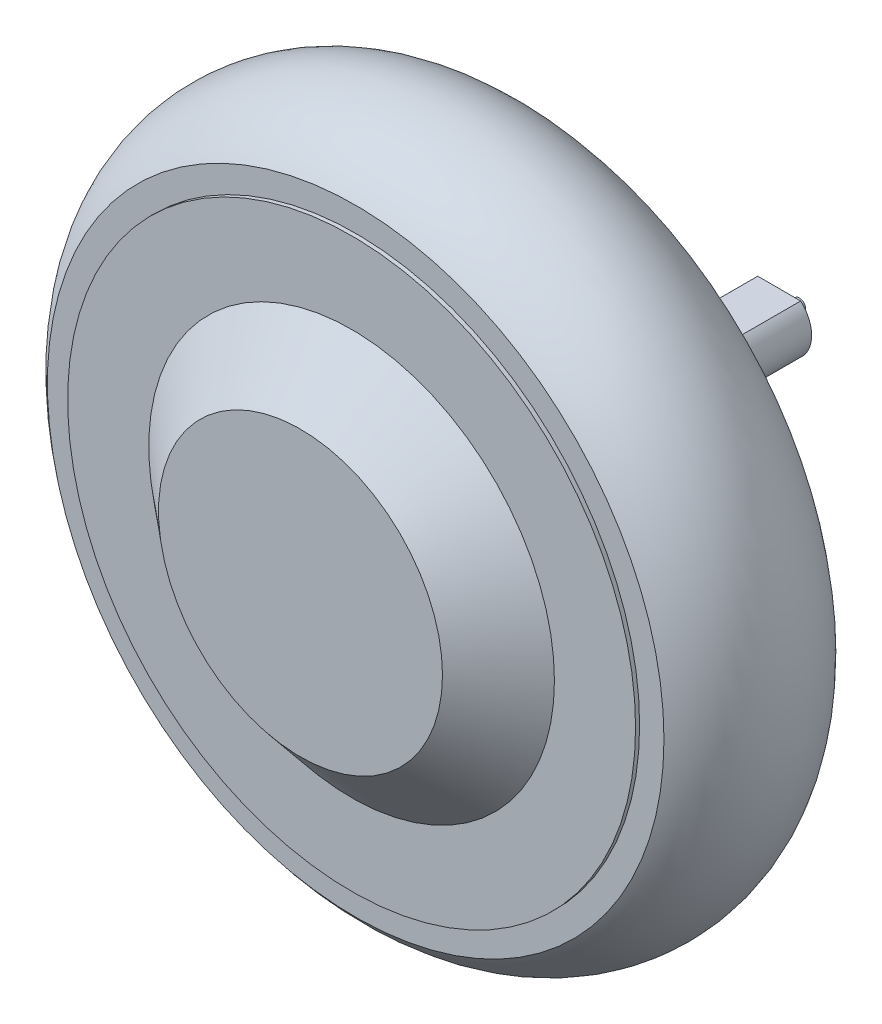
ISO-10303-21;
HEADER;
FILE_DESCRIPTION(('STEP AP214'),'2;1');
FILE_NAME('part.step','',(''),(''),'','','');
FILE_SCHEMA(('AUTOMOTIVE_DESIGN { 1 0 10303 214 1 1 1 1 }'));
ENDSEC;
DATA;
#1=APPLICATION_CONTEXT('core data for automotive mechanical design processes');
#2=APPLICATION_PROTOCOL_DEFINITION('international standard','automotive_design',2000,#1);
#3=PRODUCT_CONTEXT('',#1,'mechanical');
#4=PRODUCT('Part','Part','',(#3));
#5=PRODUCT_RELATED_PRODUCT_CATEGORY('part','',(#4));
#6=PRODUCT_DEFINITION_FORMATION('','',#4);
#7=PRODUCT_DEFINITION_CONTEXT('part definition',#1,'design');
#8=PRODUCT_DEFINITION('design','',#6,#7);
#9=PRODUCT_DEFINITION_SHAPE('','',#8);
#10=(LENGTH_UNIT() NAMED_UNIT(*) SI_UNIT(.MILLI.,.METRE.));
#11=(NAMED_UNIT(*) PLANE_ANGLE_UNIT() SI_UNIT($,.RADIAN.));
#12=(NAMED_UNIT(*) SI_UNIT($,.STERADIAN.) SOLID_ANGLE_UNIT());
#13=UNCERTAINTY_MEASURE_WITH_UNIT(LENGTH_MEASURE(1.E-05),#10,'distance_accuracy_value','');
#14=(GEOMETRIC_REPRESENTATION_CONTEXT(3) GLOBAL_UNCERTAINTY_ASSIGNED_CONTEXT((#13)) GLOBAL_UNIT_ASSIGNED_CONTEXT((#10,
#11,#12)) REPRESENTATION_CONTEXT('',''));
#15=CARTESIAN_POINT('',(0.,0.,0.));
#16=DIRECTION('',(0.,0.,1.));
#17=DIRECTION('',(1.,0.,0.));
#18=AXIS2_PLACEMENT_3D('',#15,#16,#17);
#19=CARTESIAN_POINT('',(0.,0.,0.));
#20=DIRECTION('',(0.,0.,1.));
#21=DIRECTION('',(1.,0.,0.));
#22=AXIS2_PLACEMENT_3D('',#19,#20,#21);
#23=CYLINDRICAL_SURFACE('',#22,8.);
#24=CARTESIAN_POINT('',(0.,0.,-83.4));
#25=DIRECTION('',(0.,0.,1.));
#26=DIRECTION('',(1.,0.,0.));
#27=AXIS2_PLACEMENT_3D('',#24,#25,#26);
#28=CIRCLE('',#27,8.);
#29=CARTESIAN_POINT('',(5.29150262212918,-6.,-83.4));
#30=VERTEX_POINT('',#29);
#31=CARTESIAN_POINT('',(5.29150262212918,6.,-83.4));
#32=VERTEX_POINT('',#31);
#33=EDGE_CURVE('E99',#30,#32,#28,.T.);
#34=ORIENTED_EDGE('',*,*,#33,.T.);
#35=DIRECTION('',(0.,0.,-1.));
#36=VECTOR('',#35,1.);
#37=CARTESIAN_POINT('',(5.29150262212918,6.,-39.629670385731));
#38=LINE('',#37,#36);
#39=CARTESIAN_POINT('',(5.29150262212918,6.,-50.4));
#40=VERTEX_POINT('',#39);
#41=EDGE_CURVE('E58',#40,#32,#38,.T.);
#42=ORIENTED_EDGE('',*,*,#41,.F.);
#43=CARTESIAN_POINT('',(0.,0.,-50.4));
#44=DIRECTION('',(0.,0.,1.));
#45=DIRECTION('',(1.,0.,0.));
#46=AXIS2_PLACEMENT_3D('',#43,#44,#45);
#47=CIRCLE('',#46,8.);
#48=CARTESIAN_POINT('',(5.29150262212918,-6.,-50.4));
#49=VERTEX_POINT('',#48);
#50=EDGE_CURVE('E89',#49,#40,#47,.T.);
#51=ORIENTED_EDGE('',*,*,#50,.F.);
#52=DIRECTION('',(0.,0.,-1.));
#53=VECTOR('',#52,1.);
#54=CARTESIAN_POINT('',(5.29150262212918,-6.,-39.629670385731));
#55=LINE('',#54,#53);
#56=EDGE_CURVE('E166',#49,#30,#55,.T.);
#57=ORIENTED_EDGE('',*,*,#56,.T.);
#58=EDGE_LOOP('',(#34,#42,#51,#57));
#59=FACE_BOUND('',#58,.T.);
#60=ADVANCED_FACE('F35',(#59),#23,.T.);
#61=CARTESIAN_POINT('',(0.,0.,34.6));
#62=DIRECTION('',(0.,0.,-1.));
#63=DIRECTION('',(-1.,0.,0.));
#64=AXIS2_PLACEMENT_3D('',#61,#62,#63);
#65=PLANE('',#64);
#66=CARTESIAN_POINT('',(0.,0.,34.6));
#67=DIRECTION('',(0.,0.,1.));
#68=DIRECTION('',(1.,0.,0.));
#69=AXIS2_PLACEMENT_3D('',#66,#67,#68);
#70=CIRCLE('',#69,35.);
#71=CARTESIAN_POINT('',(35.,0.,34.6));
#72=VERTEX_POINT('',#71);
#73=EDGE_CURVE('E149',#72,#72,#70,.T.);
#74=ORIENTED_EDGE('',*,*,#73,.T.);
#75=EDGE_LOOP('',(#74));
#76=FACE_BOUND('',#75,.T.);
#77=ADVANCED_FACE('F37',(#76),#65,.F.);
#78=CARTESIAN_POINT('',(0.,0.,22.));
#79=DIRECTION('',(0.,0.,-1.));
#80=DIRECTION('',(-1.,0.,0.));
#81=AXIS2_PLACEMENT_3D('',#78,#79,#80);
#82=CONICAL_SURFACE('',#81,50.,0.872136502073434);
#83=ORIENTED_EDGE('',*,*,#73,.F.);
#84=EDGE_LOOP('',(#83));
#85=FACE_BOUND('',#84,.T.);
#86=CARTESIAN_POINT('',(0.,0.,22.));
#87=DIRECTION('',(0.,0.,1.));
#88=DIRECTION('',(1.,0.,0.));
#89=AXIS2_PLACEMENT_3D('',#86,#87,#88);
#90=CIRCLE('',#89,50.);
#91=CARTESIAN_POINT('',(50.,0.,22.));
#92=VERTEX_POINT('',#91);
#93=EDGE_CURVE('E146',#92,#92,#90,.T.);
#94=ORIENTED_EDGE('',*,*,#93,.T.);
#95=EDGE_LOOP('',(#94));
#96=FACE_BOUND('',#95,.T.);
#97=ADVANCED_FACE('F190',(#85,#96),#82,.T.);
#98=CARTESIAN_POINT('',(0.,50.,22.));
#99=DIRECTION('',(0.,0.,-1.));
#100=DIRECTION('',(-1.,0.,0.));
#101=AXIS2_PLACEMENT_3D('',#98,#99,#100);
#102=PLANE('',#101);
#103=ORIENTED_EDGE('',*,*,#93,.F.);
#104=EDGE_LOOP('',(#103));
#105=FACE_BOUND('',#104,.T.);
#106=CARTESIAN_POINT('',(0.,0.,22.));
#107=DIRECTION('',(0.,0.,1.));
#108=DIRECTION('',(1.,0.,0.));
#109=AXIS2_PLACEMENT_3D('',#106,#107,#108);
#110=CIRCLE('',#109,70.);
#111=CARTESIAN_POINT('',(70.,0.,22.));
#112=VERTEX_POINT('',#111);
#113=EDGE_CURVE('E143',#112,#112,#110,.T.);
#114=ORIENTED_EDGE('',*,*,#113,.T.);
#115=EDGE_LOOP('',(#114));
#116=FACE_BOUND('',#115,.T.);
#117=ADVANCED_FACE('F262',(#105,#116),#102,.F.);
#118=CARTESIAN_POINT('',(0.,0.,0.));
#119=DIRECTION('',(0.,0.,1.));
#120=DIRECTION('',(1.,0.,0.));
#121=AXIS2_PLACEMENT_3D('',#118,#119,#120);
#122=CYLINDRICAL_SURFACE('',#121,70.);
#123=ORIENTED_EDGE('',*,*,#113,.F.);
#124=EDGE_LOOP('',(#123));
#125=FACE_BOUND('',#124,.T.);
#126=CARTESIAN_POINT('',(0.,0.,21.));
#127=DIRECTION('',(0.,0.,1.));
#128=DIRECTION('',(1.,0.,0.));
#129=AXIS2_PLACEMENT_3D('',#126,#127,#128);
#130=CIRCLE('',#129,70.);
#131=CARTESIAN_POINT('',(70.,0.,21.));
#132=VERTEX_POINT('',#131);
#133=EDGE_CURVE('E140',#132,#132,#130,.T.);
#134=ORIENTED_EDGE('',*,*,#133,.T.);
#135=EDGE_LOOP('',(#134));
#136=FACE_BOUND('',#135,.T.);
#137=ADVANCED_FACE('F258',(#125,#136),#122,.T.);
#138=CARTESIAN_POINT('',(0.,70.,21.));
#139=DIRECTION('',(0.,0.,-1.));
#140=DIRECTION('',(-1.,0.,0.));
#141=AXIS2_PLACEMENT_3D('',#138,#139,#140);
#142=PLANE('',#141);
#143=ORIENTED_EDGE('',*,*,#133,.F.);
#144=EDGE_LOOP('',(#143));
#145=FACE_BOUND('',#144,.T.);
#146=CARTESIAN_POINT('',(0.,0.,21.));
#147=DIRECTION('',(0.,0.,1.));
#148=DIRECTION('',(1.,0.,0.));
#149=AXIS2_PLACEMENT_3D('',#146,#147,#148);
#150=CIRCLE('',#149,76.);
#151=CARTESIAN_POINT('',(76.,0.,21.));
#152=VERTEX_POINT('',#151);
#153=EDGE_CURVE('E137',#152,#152,#150,.T.);
#154=ORIENTED_EDGE('',*,*,#153,.T.);
#155=EDGE_LOOP('',(#154));
#156=FACE_BOUND('',#155,.T.);
#157=ADVANCED_FACE('F254',(#145,#156),#142,.F.);
#158=CARTESIAN_POINT('',(0.,0.,0.));
#159=DIRECTION('',(0.,0.,1.));
#160=DIRECTION('',(1.,0.,0.));
#161=AXIS2_PLACEMENT_3D('',#158,#159,#160);
#162=TOROIDAL_SURFACE('',#161,60.25,26.25);
#163=ORIENTED_EDGE('',*,*,#153,.F.);
#164=EDGE_LOOP('',(#163));
#165=FACE_BOUND('',#164,.T.);
#166=CARTESIAN_POINT('',(0.,0.,-21.));
#167=DIRECTION('',(0.,0.,1.));
#168=DIRECTION('',(1.,0.,0.));
#169=AXIS2_PLACEMENT_3D('',#166,#167,#168);
#170=CIRCLE('',#169,76.);
#171=CARTESIAN_POINT('',(76.,0.,-21.));
#172=VERTEX_POINT('',#171);
#173=EDGE_CURVE('E134',#172,#172,#170,.T.);
#174=ORIENTED_EDGE('',*,*,#173,.T.);
#175=EDGE_LOOP('',(#174));
#176=FACE_BOUND('',#175,.T.);
#177=ADVANCED_FACE('F250',(#165,#176),#162,.T.);
#178=CARTESIAN_POINT('',(0.,70.,-21.));
#179=DIRECTION('',(0.,0.,1.));
#180=DIRECTION('',(1.,0.,0.));
#181=AXIS2_PLACEMENT_3D('',#178,#179,#180);
#182=PLANE('',#181);
#183=ORIENTED_EDGE('',*,*,#173,.F.);
#184=EDGE_LOOP('',(#183));
#185=FACE_BOUND('',#184,.T.);
#186=CARTESIAN_POINT('',(0.,0.,-21.));
#187=DIRECTION('',(0.,0.,1.));
#188=DIRECTION('',(1.,0.,0.));
#189=AXIS2_PLACEMENT_3D('',#186,#187,#188);
#190=CIRCLE('',#189,70.);
#191=CARTESIAN_POINT('',(70.,0.,-21.));
#192=VERTEX_POINT('',#191);
#193=EDGE_CURVE('E131',#192,#192,#190,.T.);
#194=ORIENTED_EDGE('',*,*,#193,.T.);
#195=EDGE_LOOP('',(#194));
#196=FACE_BOUND('',#195,.T.);
#197=ADVANCED_FACE('F246',(#185,#196),#182,.F.);
#198=CARTESIAN_POINT('',(0.,0.,0.));
#199=DIRECTION('',(0.,0.,1.));
#200=DIRECTION('',(1.,0.,0.));
#201=AXIS2_PLACEMENT_3D('',#198,#199,#200);
#202=CYLINDRICAL_SURFACE('',#201,70.);
#203=ORIENTED_EDGE('',*,*,#193,.F.);
#204=EDGE_LOOP('',(#203));
#205=FACE_BOUND('',#204,.T.);
#206=CARTESIAN_POINT('',(0.,0.,-22.));
#207=DIRECTION('',(0.,0.,1.));
#208=DIRECTION('',(1.,0.,0.));
#209=AXIS2_PLACEMENT_3D('',#206,#207,#208);
#210=CIRCLE('',#209,70.);
#211=CARTESIAN_POINT('',(70.,0.,-22.));
#212=VERTEX_POINT('',#211);
#213=EDGE_CURVE('E128',#212,#212,#210,.T.);
#214=ORIENTED_EDGE('',*,*,#213,.T.);
#215=EDGE_LOOP('',(#214));
#216=FACE_BOUND('',#215,.T.);
#217=ADVANCED_FACE('F242',(#205,#216),#202,.T.);
#218=CARTESIAN_POINT('',(0.,50.,-22.));
#219=DIRECTION('',(0.,0.,1.));
#220=DIRECTION('',(1.,0.,0.));
#221=AXIS2_PLACEMENT_3D('',#218,#219,#220);
#222=PLANE('',#221);
#223=ORIENTED_EDGE('',*,*,#213,.F.);
#224=EDGE_LOOP('',(#223));
#225=FACE_BOUND('',#224,.T.);
#226=CARTESIAN_POINT('',(0.,0.,-22.));
#227=DIRECTION('',(0.,0.,1.));
#228=DIRECTION('',(1.,0.,0.));
#229=AXIS2_PLACEMENT_3D('',#226,#227,#228);
#230=CIRCLE('',#229,50.);
#231=CARTESIAN_POINT('',(50.,0.,-22.));
#232=VERTEX_POINT('',#231);
#233=EDGE_CURVE('E125',#232,#232,#230,.T.);
#234=ORIENTED_EDGE('',*,*,#233,.T.);
#235=EDGE_LOOP('',(#234));
#236=FACE_BOUND('',#235,.T.);
#237=ADVANCED_FACE('F238',(#225,#236),#222,.F.);
#238=CARTESIAN_POINT('',(0.,0.,-34.6));
#239=DIRECTION('',(0.,0.,1.));
#240=DIRECTION('',(1.,0.,0.));
#241=AXIS2_PLACEMENT_3D('',#238,#239,#240);
#242=CONICAL_SURFACE('',#241,35.,0.872136502073434);
#243=ORIENTED_EDGE('',*,*,#233,.F.);
#244=EDGE_LOOP('',(#243));
#245=FACE_BOUND('',#244,.T.);
#246=CARTESIAN_POINT('',(0.,0.,-34.6));
#247=DIRECTION('',(0.,0.,1.));
#248=DIRECTION('',(1.,0.,0.));
#249=AXIS2_PLACEMENT_3D('',#246,#247,#248);
#250=CIRCLE('',#249,35.);
#251=CARTESIAN_POINT('',(35.,0.,-34.6));
#252=VERTEX_POINT('',#251);
#253=EDGE_CURVE('E122',#252,#252,#250,.T.);
#254=ORIENTED_EDGE('',*,*,#253,.T.);
#255=EDGE_LOOP('',(#254));
#256=FACE_BOUND('',#255,.T.);
#257=ADVANCED_FACE('F234',(#245,#256),#242,.T.);
#258=CARTESIAN_POINT('',(0.,25.,-34.6));
#259=DIRECTION('',(0.,0.,1.));
#260=DIRECTION('',(1.,0.,0.));
#261=AXIS2_PLACEMENT_3D('',#258,#259,#260);
#262=PLANE('',#261);
#263=ORIENTED_EDGE('',*,*,#253,.F.);
#264=EDGE_LOOP('',(#263));
#265=FACE_BOUND('',#264,.T.);
#266=CARTESIAN_POINT('',(0.,0.,-34.6));
#267=DIRECTION('',(0.,0.,1.));
#268=DIRECTION('',(1.,0.,0.));
#269=AXIS2_PLACEMENT_3D('',#266,#267,#268);
#270=CIRCLE('',#269,25.);
#271=CARTESIAN_POINT('',(25.,0.,-34.6));
#272=VERTEX_POINT('',#271);
#273=EDGE_CURVE('E119',#272,#272,#270,.T.);
#274=ORIENTED_EDGE('',*,*,#273,.T.);
#275=EDGE_LOOP('',(#274));
#276=FACE_BOUND('',#275,.T.);
#277=ADVANCED_FACE('F230',(#265,#276),#262,.F.);
#278=CARTESIAN_POINT('',(0.,0.,-40.4));
#279=DIRECTION('',(0.,0.,1.));
#280=DIRECTION('',(1.,0.,0.));
#281=AXIS2_PLACEMENT_3D('',#278,#279,#280);
#282=CONICAL_SURFACE('',#281,19.1999999999999,0.785398163397452);
#283=ORIENTED_EDGE('',*,*,#273,.F.);
#284=EDGE_LOOP('',(#283));
#285=FACE_BOUND('',#284,.T.);
#286=CARTESIAN_POINT('',(0.,0.,-40.4));
#287=DIRECTION('',(0.,0.,1.));
#288=DIRECTION('',(1.,0.,0.));
#289=AXIS2_PLACEMENT_3D('',#286,#287,#288);
#290=CIRCLE('',#289,19.1999999999999);
#291=CARTESIAN_POINT('',(19.1999999999999,0.,-40.4));
#292=VERTEX_POINT('',#291);
#293=EDGE_CURVE('E116',#292,#292,#290,.T.);
#294=ORIENTED_EDGE('',*,*,#293,.T.);
#295=EDGE_LOOP('',(#294));
#296=FACE_BOUND('',#295,.T.);
#297=ADVANCED_FACE('F226',(#285,#296),#282,.T.);
#298=CARTESIAN_POINT('',(0.,19.1999999999999,-40.4));
#299=DIRECTION('',(0.,0.,1.));
#300=DIRECTION('',(1.,0.,0.));
#301=AXIS2_PLACEMENT_3D('',#298,#299,#300);
#302=PLANE('',#301);
#303=ORIENTED_EDGE('',*,*,#293,.F.);
#304=EDGE_LOOP('',(#303));
#305=FACE_BOUND('',#304,.T.);
#306=CARTESIAN_POINT('',(0.,0.,-40.4));
#307=DIRECTION('',(0.,0.,1.));
#308=DIRECTION('',(1.,0.,0.));
#309=AXIS2_PLACEMENT_3D('',#306,#307,#308);
#310=CIRCLE('',#309,12.);
#311=CARTESIAN_POINT('',(12.,0.,-40.4));
#312=VERTEX_POINT('',#311);
#313=EDGE_CURVE('E113',#312,#312,#310,.T.);
#314=ORIENTED_EDGE('',*,*,#313,.T.);
#315=EDGE_LOOP('',(#314));
#316=FACE_BOUND('',#315,.T.);
#317=ADVANCED_FACE('F222',(#305,#316),#302,.F.);
#318=CARTESIAN_POINT('',(0.,0.,0.));
#319=DIRECTION('',(0.,0.,1.));
#320=DIRECTION('',(1.,0.,0.));
#321=AXIS2_PLACEMENT_3D('',#318,#319,#320);
#322=CYLINDRICAL_SURFACE('',#321,12.);
#323=ORIENTED_EDGE('',*,*,#313,.F.);
#324=EDGE_LOOP('',(#323));
#325=FACE_BOUND('',#324,.T.);
#326=CARTESIAN_POINT('',(0.,0.,-45.4));
#327=DIRECTION('',(0.,0.,1.));
#328=DIRECTION('',(1.,0.,0.));
#329=AXIS2_PLACEMENT_3D('',#326,#327,#328);
#330=CIRCLE('',#329,12.);
#331=CARTESIAN_POINT('',(12.,0.,-45.4));
#332=VERTEX_POINT('',#331);
#333=EDGE_CURVE('E110',#332,#332,#330,.T.);
#334=ORIENTED_EDGE('',*,*,#333,.T.);
#335=EDGE_LOOP('',(#334));
#336=FACE_BOUND('',#335,.T.);
#337=ADVANCED_FACE('F218',(#325,#336),#322,.T.);
#338=CARTESIAN_POINT('',(0.,12.,-45.4));
#339=DIRECTION('',(0.,0.,-1.));
#340=DIRECTION('',(-1.,0.,0.));
#341=AXIS2_PLACEMENT_3D('',#338,#339,#340);
#342=PLANE('',#341);
#343=ORIENTED_EDGE('',*,*,#333,.F.);
#344=EDGE_LOOP('',(#343));
#345=FACE_BOUND('',#344,.T.);
#346=CARTESIAN_POINT('',(0.,0.,-45.4));
#347=DIRECTION('',(0.,0.,1.));
#348=DIRECTION('',(1.,0.,0.));
#349=AXIS2_PLACEMENT_3D('',#346,#347,#348);
#350=CIRCLE('',#349,14.);
#351=CARTESIAN_POINT('',(14.,0.,-45.4));
#352=VERTEX_POINT('',#351);
#353=EDGE_CURVE('E107',#352,#352,#350,.T.);
#354=ORIENTED_EDGE('',*,*,#353,.T.);
#355=EDGE_LOOP('',(#354));
#356=FACE_BOUND('',#355,.T.);
#357=ADVANCED_FACE('F214',(#345,#356),#342,.F.);
#358=CARTESIAN_POINT('',(0.,0.,0.));
#359=DIRECTION('',(0.,0.,1.));
#360=DIRECTION('',(1.,0.,0.));
#361=AXIS2_PLACEMENT_3D('',#358,#359,#360);
#362=CYLINDRICAL_SURFACE('',#361,14.);
#363=ORIENTED_EDGE('',*,*,#353,.F.);
#364=EDGE_LOOP('',(#363));
#365=FACE_BOUND('',#364,.T.);
#366=CARTESIAN_POINT('',(0.,0.,-48.4));
#367=DIRECTION('',(0.,0.,1.));
#368=DIRECTION('',(1.,0.,0.));
#369=AXIS2_PLACEMENT_3D('',#366,#367,#368);
#370=CIRCLE('',#369,14.);
#371=CARTESIAN_POINT('',(14.,0.,-48.4));
#372=VERTEX_POINT('',#371);
#373=EDGE_CURVE('E104',#372,#372,#370,.T.);
#374=ORIENTED_EDGE('',*,*,#373,.T.);
#375=EDGE_LOOP('',(#374));
#376=FACE_BOUND('',#375,.T.);
#377=ADVANCED_FACE('F210',(#365,#376),#362,.T.);
#378=CARTESIAN_POINT('',(0.,14.,-48.4));
#379=DIRECTION('',(0.,0.,-1.));
#380=DIRECTION('',(-1.,0.,0.));
#381=AXIS2_PLACEMENT_3D('',#378,#379,#380);
#382=PLANE('',#381);
#383=ORIENTED_EDGE('',*,*,#373,.F.);
#384=EDGE_LOOP('',(#383));
#385=FACE_BOUND('',#384,.T.);
#386=CARTESIAN_POINT('',(0.,0.,-48.4));
#387=DIRECTION('',(0.,0.,1.));
#388=DIRECTION('',(1.,0.,0.));
#389=AXIS2_PLACEMENT_3D('',#386,#387,#388);
#390=CIRCLE('',#389,16.);
#391=CARTESIAN_POINT('',(16.,0.,-48.4));
#392=VERTEX_POINT('',#391);
#393=EDGE_CURVE('E95',#392,#392,#390,.T.);
#394=ORIENTED_EDGE('',*,*,#393,.T.);
#395=EDGE_LOOP('',(#394));
#396=FACE_BOUND('',#395,.T.);
#397=ADVANCED_FACE('F203',(#385,#396),#382,.F.);
#398=CARTESIAN_POINT('',(0.,0.,0.));
#399=DIRECTION('',(0.,0.,1.));
#400=DIRECTION('',(1.,0.,0.));
#401=AXIS2_PLACEMENT_3D('',#398,#399,#400);
#402=CYLINDRICAL_SURFACE('',#401,16.);
#403=ORIENTED_EDGE('',*,*,#393,.F.);
#404=EDGE_LOOP('',(#403));
#405=FACE_BOUND('',#404,.T.);
#406=CARTESIAN_POINT('',(0.,0.,-50.4));
#407=DIRECTION('',(0.,0.,1.));
#408=DIRECTION('',(1.,0.,0.));
#409=AXIS2_PLACEMENT_3D('',#406,#407,#408);
#410=CIRCLE('',#409,16.);
#411=CARTESIAN_POINT('',(16.,0.,-50.4));
#412=VERTEX_POINT('',#411);
#413=EDGE_CURVE('E92',#412,#412,#410,.T.);
#414=ORIENTED_EDGE('',*,*,#413,.T.);
#415=EDGE_LOOP('',(#414));
#416=FACE_BOUND('',#415,.T.);
#417=ADVANCED_FACE('F198',(#405,#416),#402,.T.);
#418=CARTESIAN_POINT('',(0.,16.,-50.4));
#419=DIRECTION('',(0.,0.,1.));
#420=DIRECTION('',(1.,0.,0.));
#421=AXIS2_PLACEMENT_3D('',#418,#419,#420);
#422=PLANE('',#421);
#423=ORIENTED_EDGE('',*,*,#413,.F.);
#424=EDGE_LOOP('',(#423));
#425=FACE_BOUND('',#424,.T.);
#426=ORIENTED_EDGE('',*,*,#50,.T.);
#427=DIRECTION('',(-1.,0.,0.));
#428=VECTOR('',#427,1.);
#429=CARTESIAN_POINT('',(5.29150262212918,6.,-50.4));
#430=LINE('',#429,#428);
#431=CARTESIAN_POINT('',(-5.29150262212918,6.,-50.4));
#432=VERTEX_POINT('',#431);
#433=EDGE_CURVE('E76',#40,#432,#430,.T.);
#434=ORIENTED_EDGE('',*,*,#433,.T.);
#435=CARTESIAN_POINT('',(-5.29150262212918,-6.,-50.4));
#436=VERTEX_POINT('',#435);
#437=EDGE_CURVE('E87',#432,#436,#47,.T.);
#438=ORIENTED_EDGE('',*,*,#437,.T.);
#439=DIRECTION('',(1.,0.,0.));
#440=VECTOR('',#439,1.);
#441=CARTESIAN_POINT('',(5.29150262212918,-6.,-50.4));
#442=LINE('',#441,#440);
#443=EDGE_CURVE('E168',#436,#49,#442,.T.);
#444=ORIENTED_EDGE('',*,*,#443,.T.);
#445=EDGE_LOOP('',(#426,#434,#438,#444));
#446=FACE_BOUND('',#445,.T.);
#447=ADVANCED_FACE('F85',(#425,#446),#422,.F.);
#448=ORIENTED_EDGE('',*,*,#437,.F.);
#449=DIRECTION('',(0.,0.,-1.));
#450=VECTOR('',#449,1.);
#451=CARTESIAN_POINT('',(-5.29150262212918,6.,-39.629670385731));
#452=LINE('',#451,#450);
#453=CARTESIAN_POINT('',(-5.29150262212918,6.,-83.4));
#454=VERTEX_POINT('',#453);
#455=EDGE_CURVE('E73',#432,#454,#452,.T.);
#456=ORIENTED_EDGE('',*,*,#455,.T.);
#457=CARTESIAN_POINT('',(-5.29150262212918,-6.,-83.4));
#458=VERTEX_POINT('',#457);
#459=EDGE_CURVE('E97',#454,#458,#28,.T.);
#460=ORIENTED_EDGE('',*,*,#459,.T.);
#461=DIRECTION('',(0.,0.,-1.));
#462=VECTOR('',#461,1.);
#463=CARTESIAN_POINT('',(-5.29150262212918,-6.,-39.629670385731));
#464=LINE('',#463,#462);
#465=EDGE_CURVE('E50',#436,#458,#464,.T.);
#466=ORIENTED_EDGE('',*,*,#465,.F.);
#467=EDGE_LOOP('',(#448,#456,#460,#466));
#468=FACE_BOUND('',#467,.T.);
#469=ADVANCED_FACE('F91',(#468),#23,.T.);
#470=CARTESIAN_POINT('',(0.,1.5,-83.4));
#471=DIRECTION('',(0.,0.,1.));
#472=DIRECTION('',(1.,0.,0.));
#473=AXIS2_PLACEMENT_3D('',#470,#471,#472);
#474=PLANE('',#473);
#475=ORIENTED_EDGE('',*,*,#459,.F.);
#476=DIRECTION('',(1.,0.,0.));
#477=VECTOR('',#476,1.);
#478=CARTESIAN_POINT('',(0.,6.,-83.4));
#479=LINE('',#478,#477);
#480=EDGE_CURVE('E11',#454,#32,#479,.T.);
#481=ORIENTED_EDGE('',*,*,#480,.T.);
#482=ORIENTED_EDGE('',*,*,#33,.F.);
#483=DIRECTION('',(-1.,0.,0.));
#484=VECTOR('',#483,1.);
#485=CARTESIAN_POINT('',(0.,-6.,-83.4));
#486=LINE('',#485,#484);
#487=EDGE_CURVE('E43',#30,#458,#486,.T.);
#488=ORIENTED_EDGE('',*,*,#487,.T.);
#489=EDGE_LOOP('',(#475,#481,#482,#488));
#490=FACE_BOUND('',#489,.T.);
#491=CARTESIAN_POINT('',(0.,0.,-83.4));
#492=DIRECTION('',(0.,0.,1.));
#493=DIRECTION('',(1.,0.,0.));
#494=AXIS2_PLACEMENT_3D('',#491,#492,#493);
#495=CIRCLE('',#494,1.5);
#496=CARTESIAN_POINT('',(1.5,0.,-83.4));
#497=VERTEX_POINT('',#496);
#498=EDGE_CURVE('E157',#497,#497,#495,.T.);
#499=ORIENTED_EDGE('',*,*,#498,.T.);
#500=EDGE_LOOP('',(#499));
#501=FACE_BOUND('',#500,.T.);
#502=ADVANCED_FACE('F153',(#490,#501),#474,.F.);
#503=CARTESIAN_POINT('',(0.,0.,0.));
#504=DIRECTION('',(0.,0.,1.));
#505=DIRECTION('',(1.,0.,0.));
#506=AXIS2_PLACEMENT_3D('',#503,#504,#505);
#507=CYLINDRICAL_SURFACE('',#506,1.5);
#508=ORIENTED_EDGE('',*,*,#498,.F.);
#509=EDGE_LOOP('',(#508));
#510=FACE_BOUND('',#509,.T.);
#511=CARTESIAN_POINT('',(0.,0.,-88.4));
#512=DIRECTION('',(0.,0.,1.));
#513=DIRECTION('',(1.,0.,0.));
#514=AXIS2_PLACEMENT_3D('',#511,#512,#513);
#515=CIRCLE('',#514,1.5);
#516=CARTESIAN_POINT('',(1.5,0.,-88.4));
#517=VERTEX_POINT('',#516);
#518=EDGE_CURVE('E160',#517,#517,#515,.T.);
#519=ORIENTED_EDGE('',*,*,#518,.T.);
#520=EDGE_LOOP('',(#519));
#521=FACE_BOUND('',#520,.T.);
#522=ADVANCED_FACE('F180',(#510,#521),#507,.T.);
#523=CARTESIAN_POINT('',(0.,1.5,-88.4));
#524=DIRECTION('',(0.,0.,1.));
#525=DIRECTION('',(1.,0.,0.));
#526=AXIS2_PLACEMENT_3D('',#523,#524,#525);
#527=PLANE('',#526);
#528=ORIENTED_EDGE('',*,*,#518,.F.);
#529=EDGE_LOOP('',(#528));
#530=FACE_BOUND('',#529,.T.);
#531=ADVANCED_FACE('F172',(#530),#527,.F.);
#532=CARTESIAN_POINT('',(5.29150262212918,-6.,-39.629670385731));
#533=DIRECTION('',(0.,1.,0.));
#534=DIRECTION('',(0.,0.,1.));
#535=AXIS2_PLACEMENT_3D('',#532,#533,#534);
#536=PLANE('',#535);
#537=ORIENTED_EDGE('',*,*,#56,.F.);
#538=ORIENTED_EDGE('',*,*,#443,.F.);
#539=ORIENTED_EDGE('',*,*,#465,.T.);
#540=ORIENTED_EDGE('',*,*,#487,.F.);
#541=EDGE_LOOP('',(#537,#538,#539,#540));
#542=FACE_BOUND('',#541,.T.);
#543=ADVANCED_FACE('F170',(#542),#536,.F.);
#544=CARTESIAN_POINT('',(5.29150262212918,6.,-39.629670385731));
#545=DIRECTION('',(0.,-1.,0.));
#546=DIRECTION('',(0.,0.,-1.));
#547=AXIS2_PLACEMENT_3D('',#544,#545,#546);
#548=PLANE('',#547);
#549=ORIENTED_EDGE('',*,*,#455,.F.);
#550=ORIENTED_EDGE('',*,*,#433,.F.);
#551=ORIENTED_EDGE('',*,*,#41,.T.);
#552=ORIENTED_EDGE('',*,*,#480,.F.);
#553=EDGE_LOOP('',(#549,#550,#551,#552));
#554=FACE_BOUND('',#553,.T.);
#555=ADVANCED_FACE('F75',(#554),#548,.F.);
#556=CLOSED_SHELL('',(#60,#77,#97,#117,#137,#157,#177,#197,#217,#237,#257,#277,#297,#317,#337,
#357,#377,#397,#417,#447,#469,#502,#522,#531,#543,#555));
#557=MANIFOLD_SOLID_BREP('B2',#556);
#558=ADVANCED_BREP_SHAPE_REPRESENTATION('',(#18,#557),#14);
#559=SHAPE_DEFINITION_REPRESENTATION(#9,#558);
ENDSEC;
END-ISO-10303-21;
